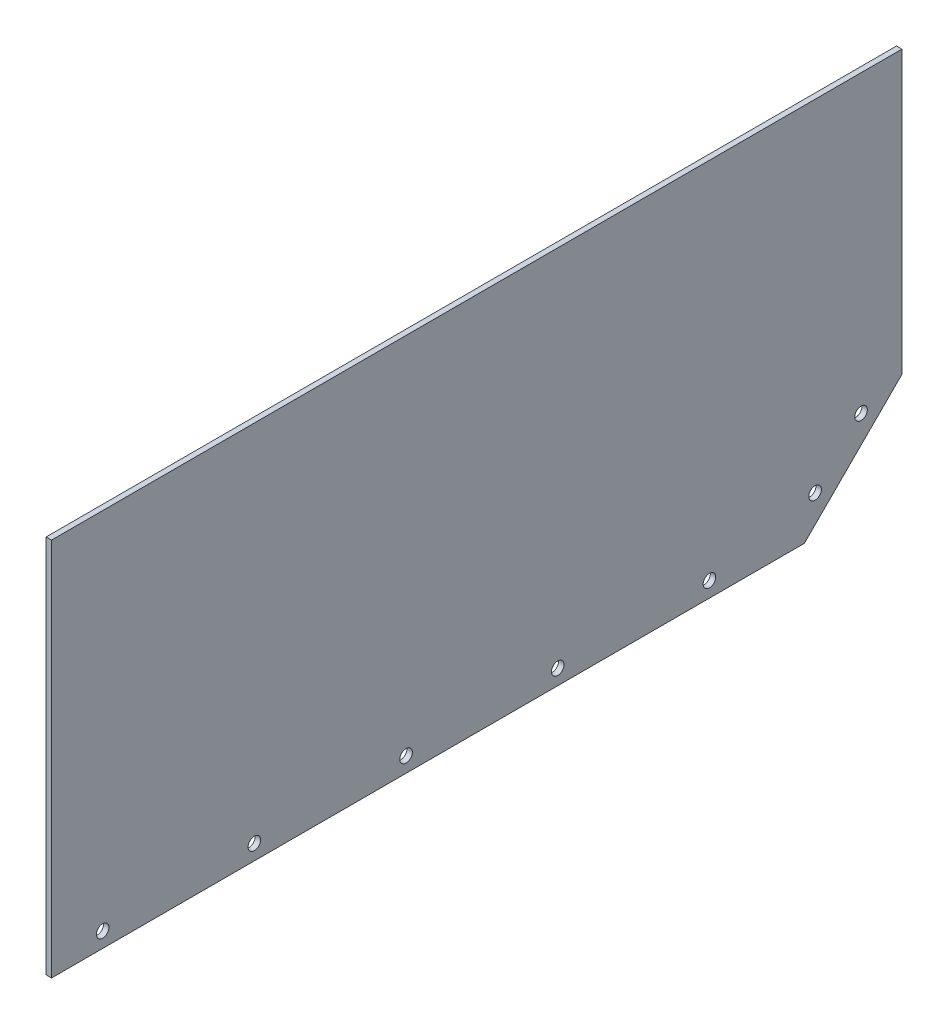
ISO-10303-21;
HEADER;
FILE_DESCRIPTION(('STEP AP214'),'2;1');
FILE_NAME('part.step','',(''),(''),'','','');
FILE_SCHEMA(('AUTOMOTIVE_DESIGN { 1 0 10303 214 1 1 1 1 }'));
ENDSEC;
DATA;
#1=APPLICATION_CONTEXT('core data for automotive mechanical design processes');
#2=APPLICATION_PROTOCOL_DEFINITION('international standard','automotive_design',2000,#1);
#3=PRODUCT_CONTEXT('',#1,'mechanical');
#4=PRODUCT('Part','Part','',(#3));
#5=PRODUCT_RELATED_PRODUCT_CATEGORY('part','',(#4));
#6=PRODUCT_DEFINITION_FORMATION('','',#4);
#7=PRODUCT_DEFINITION_CONTEXT('part definition',#1,'design');
#8=PRODUCT_DEFINITION('design','',#6,#7);
#9=PRODUCT_DEFINITION_SHAPE('','',#8);
#10=(LENGTH_UNIT() NAMED_UNIT(*) SI_UNIT(.MILLI.,.METRE.));
#11=(NAMED_UNIT(*) PLANE_ANGLE_UNIT() SI_UNIT($,.RADIAN.));
#12=(NAMED_UNIT(*) SI_UNIT($,.STERADIAN.) SOLID_ANGLE_UNIT());
#13=UNCERTAINTY_MEASURE_WITH_UNIT(LENGTH_MEASURE(1.E-05),#10,'distance_accuracy_value','');
#14=(GEOMETRIC_REPRESENTATION_CONTEXT(3) GLOBAL_UNCERTAINTY_ASSIGNED_CONTEXT((#13)) GLOBAL_UNIT_ASSIGNED_CONTEXT((#10,
#11,#12)) REPRESENTATION_CONTEXT('',''));
#15=CARTESIAN_POINT('',(0.,0.,0.));
#16=DIRECTION('',(0.,0.,1.));
#17=DIRECTION('',(1.,0.,0.));
#18=AXIS2_PLACEMENT_3D('',#15,#16,#17);
#19=CARTESIAN_POINT('',(1.5875,-130.81,-136.398));
#20=DIRECTION('',(-1.,0.,0.));
#21=DIRECTION('',(0.,0.,1.));
#22=AXIS2_PLACEMENT_3D('',#19,#20,#21);
#23=CYLINDRICAL_SURFACE('',#22,3.67500000000002);
#24=CARTESIAN_POINT('',(1.5875,-130.81,-136.398));
#25=DIRECTION('',(-1.,0.,0.));
#26=DIRECTION('',(0.,0.,1.));
#27=AXIS2_PLACEMENT_3D('',#24,#25,#26);
#28=CIRCLE('',#27,3.67500000000002);
#29=CARTESIAN_POINT('',(1.5875,-130.81,-132.723));
#30=VERTEX_POINT('',#29);
#31=EDGE_CURVE('E50',#30,#30,#28,.T.);
#32=ORIENTED_EDGE('',*,*,#31,.F.);
#33=EDGE_LOOP('',(#32));
#34=FACE_BOUND('',#33,.T.);
#35=CARTESIAN_POINT('',(-1.5875,-130.81,-136.398));
#36=DIRECTION('',(-1.,0.,0.));
#37=DIRECTION('',(0.,0.,1.));
#38=AXIS2_PLACEMENT_3D('',#35,#36,#37);
#39=CIRCLE('',#38,3.67500000000002);
#40=CARTESIAN_POINT('',(-1.5875,-130.81,-132.723));
#41=VERTEX_POINT('',#40);
#42=EDGE_CURVE('E11',#41,#41,#39,.T.);
#43=ORIENTED_EDGE('',*,*,#42,.T.);
#44=EDGE_LOOP('',(#43));
#45=FACE_BOUND('',#44,.T.);
#46=ADVANCED_FACE('F40',(#34,#45),#23,.F.);
#47=CARTESIAN_POINT('',(1.5875,-130.81,-47.498));
#48=DIRECTION('',(-1.,0.,0.));
#49=DIRECTION('',(0.,0.,1.));
#50=AXIS2_PLACEMENT_3D('',#47,#48,#49);
#51=CYLINDRICAL_SURFACE('',#50,3.67500000000002);
#52=CARTESIAN_POINT('',(1.5875,-130.81,-47.498));
#53=DIRECTION('',(-1.,0.,0.));
#54=DIRECTION('',(0.,0.,1.));
#55=AXIS2_PLACEMENT_3D('',#52,#53,#54);
#56=CIRCLE('',#55,3.67500000000002);
#57=CARTESIAN_POINT('',(1.5875,-130.81,-43.823));
#58=VERTEX_POINT('',#57);
#59=EDGE_CURVE('E157',#58,#58,#56,.T.);
#60=ORIENTED_EDGE('',*,*,#59,.F.);
#61=EDGE_LOOP('',(#60));
#62=FACE_BOUND('',#61,.T.);
#63=CARTESIAN_POINT('',(-1.5875,-130.81,-47.498));
#64=DIRECTION('',(-1.,0.,0.));
#65=DIRECTION('',(0.,0.,1.));
#66=AXIS2_PLACEMENT_3D('',#63,#64,#65);
#67=CIRCLE('',#66,3.67500000000002);
#68=CARTESIAN_POINT('',(-1.5875,-130.81,-43.823));
#69=VERTEX_POINT('',#68);
#70=EDGE_CURVE('E161',#69,#69,#67,.T.);
#71=ORIENTED_EDGE('',*,*,#70,.T.);
#72=EDGE_LOOP('',(#71));
#73=FACE_BOUND('',#72,.T.);
#74=ADVANCED_FACE('F219',(#62,#73),#51,.F.);
#75=CARTESIAN_POINT('',(1.5875,-130.81,41.402));
#76=DIRECTION('',(-1.,0.,0.));
#77=DIRECTION('',(0.,0.,1.));
#78=AXIS2_PLACEMENT_3D('',#75,#76,#77);
#79=CYLINDRICAL_SURFACE('',#78,3.67500000000002);
#80=CARTESIAN_POINT('',(1.5875,-130.81,41.402));
#81=DIRECTION('',(-1.,0.,0.));
#82=DIRECTION('',(0.,0.,1.));
#83=AXIS2_PLACEMENT_3D('',#80,#81,#82);
#84=CIRCLE('',#83,3.67500000000002);
#85=CARTESIAN_POINT('',(1.5875,-130.81,45.077));
#86=VERTEX_POINT('',#85);
#87=EDGE_CURVE('E149',#86,#86,#84,.T.);
#88=ORIENTED_EDGE('',*,*,#87,.F.);
#89=EDGE_LOOP('',(#88));
#90=FACE_BOUND('',#89,.T.);
#91=CARTESIAN_POINT('',(-1.5875,-130.81,41.402));
#92=DIRECTION('',(-1.,0.,0.));
#93=DIRECTION('',(0.,0.,1.));
#94=AXIS2_PLACEMENT_3D('',#91,#92,#93);
#95=CIRCLE('',#94,3.67500000000002);
#96=CARTESIAN_POINT('',(-1.5875,-130.81,45.077));
#97=VERTEX_POINT('',#96);
#98=EDGE_CURVE('E153',#97,#97,#95,.T.);
#99=ORIENTED_EDGE('',*,*,#98,.T.);
#100=EDGE_LOOP('',(#99));
#101=FACE_BOUND('',#100,.T.);
#102=ADVANCED_FACE('F216',(#90,#101),#79,.F.);
#103=CARTESIAN_POINT('',(1.5875,82.55,-249.174));
#104=DIRECTION('',(0.,0.,1.));
#105=DIRECTION('',(0.,-1.,0.));
#106=AXIS2_PLACEMENT_3D('',#103,#104,#105);
#107=PLANE('',#106);
#108=DIRECTION('',(0.,1.,0.));
#109=VECTOR('',#108,1.);
#110=CARTESIAN_POINT('',(-1.5875,82.55,-249.174));
#111=LINE('',#110,#109);
#112=CARTESIAN_POINT('',(-1.5875,-82.55,-249.174));
#113=VERTEX_POINT('',#112);
#114=CARTESIAN_POINT('',(-1.5875,82.55,-249.174));
#115=VERTEX_POINT('',#114);
#116=EDGE_CURVE('E126',#113,#115,#111,.T.);
#117=ORIENTED_EDGE('',*,*,#116,.T.);
#118=DIRECTION('',(-1.,0.,0.));
#119=VECTOR('',#118,1.);
#120=CARTESIAN_POINT('',(1.5875,82.55,-249.174));
#121=LINE('',#120,#119);
#122=CARTESIAN_POINT('',(1.5875,82.55,-249.174));
#123=VERTEX_POINT('',#122);
#124=EDGE_CURVE('E146',#123,#115,#121,.T.);
#125=ORIENTED_EDGE('',*,*,#124,.F.);
#126=DIRECTION('',(0.,1.,0.));
#127=VECTOR('',#126,1.);
#128=CARTESIAN_POINT('',(1.5875,82.55,-249.174));
#129=LINE('',#128,#127);
#130=CARTESIAN_POINT('',(1.5875,-82.55,-249.174));
#131=VERTEX_POINT('',#130);
#132=EDGE_CURVE('E59',#131,#123,#129,.T.);
#133=ORIENTED_EDGE('',*,*,#132,.F.);
#134=DIRECTION('',(-1.,0.,0.));
#135=VECTOR('',#134,1.);
#136=CARTESIAN_POINT('',(1.5875,-82.55,-249.174));
#137=LINE('',#136,#135);
#138=EDGE_CURVE('E77',#131,#113,#137,.T.);
#139=ORIENTED_EDGE('',*,*,#138,.T.);
#140=EDGE_LOOP('',(#117,#125,#133,#139));
#141=FACE_BOUND('',#140,.T.);
#142=ADVANCED_FACE('F209',(#141),#107,.F.);
#143=CARTESIAN_POINT('',(1.5875,82.55,249.174));
#144=DIRECTION('',(0.,-1.,0.));
#145=DIRECTION('',(0.,0.,-1.));
#146=AXIS2_PLACEMENT_3D('',#143,#144,#145);
#147=PLANE('',#146);
#148=DIRECTION('',(0.,0.,1.));
#149=VECTOR('',#148,1.);
#150=CARTESIAN_POINT('',(-1.5875,82.55,249.174));
#151=LINE('',#150,#149);
#152=CARTESIAN_POINT('',(-1.5875,82.55,249.174));
#153=VERTEX_POINT('',#152);
#154=EDGE_CURVE('E74',#115,#153,#151,.T.);
#155=ORIENTED_EDGE('',*,*,#154,.T.);
#156=DIRECTION('',(-1.,0.,0.));
#157=VECTOR('',#156,1.);
#158=CARTESIAN_POINT('',(1.5875,82.55,249.174));
#159=LINE('',#158,#157);
#160=CARTESIAN_POINT('',(1.5875,82.55,249.174));
#161=VERTEX_POINT('',#160);
#162=EDGE_CURVE('E101',#161,#153,#159,.T.);
#163=ORIENTED_EDGE('',*,*,#162,.F.);
#164=DIRECTION('',(0.,0.,1.));
#165=VECTOR('',#164,1.);
#166=CARTESIAN_POINT('',(1.5875,82.55,249.174));
#167=LINE('',#166,#165);
#168=EDGE_CURVE('E80',#123,#161,#167,.T.);
#169=ORIENTED_EDGE('',*,*,#168,.F.);
#170=ORIENTED_EDGE('',*,*,#124,.T.);
#171=EDGE_LOOP('',(#155,#163,#169,#170));
#172=FACE_BOUND('',#171,.T.);
#173=ADVANCED_FACE('F207',(#172),#147,.F.);
#174=CARTESIAN_POINT('',(1.5875,82.55,249.174));
#175=DIRECTION('',(0.,0.,-1.));
#176=DIRECTION('',(-1.,0.,0.));
#177=AXIS2_PLACEMENT_3D('',#174,#175,#176);
#178=PLANE('',#177);
#179=DIRECTION('',(0.,-1.,0.));
#180=VECTOR('',#179,1.);
#181=CARTESIAN_POINT('',(-1.5875,82.55,249.174));
#182=LINE('',#181,#180);
#183=CARTESIAN_POINT('',(-1.5875,-139.7,249.174));
#184=VERTEX_POINT('',#183);
#185=EDGE_CURVE('E95',#153,#184,#182,.T.);
#186=ORIENTED_EDGE('',*,*,#185,.T.);
#187=DIRECTION('',(1.,0.,0.));
#188=VECTOR('',#187,1.);
#189=CARTESIAN_POINT('',(-1.5875,-139.7,249.174));
#190=LINE('',#189,#188);
#191=CARTESIAN_POINT('',(1.5875,-139.7,249.174));
#192=VERTEX_POINT('',#191);
#193=EDGE_CURVE('E100',#184,#192,#190,.T.);
#194=ORIENTED_EDGE('',*,*,#193,.T.);
#195=DIRECTION('',(0.,-1.,0.));
#196=VECTOR('',#195,1.);
#197=CARTESIAN_POINT('',(1.5875,82.55,249.174));
#198=LINE('',#197,#196);
#199=EDGE_CURVE('E135',#161,#192,#198,.T.);
#200=ORIENTED_EDGE('',*,*,#199,.F.);
#201=ORIENTED_EDGE('',*,*,#162,.T.);
#202=EDGE_LOOP('',(#186,#194,#200,#201));
#203=FACE_BOUND('',#202,.T.);
#204=ADVANCED_FACE('F97',(#203),#178,.F.);
#205=CARTESIAN_POINT('',(1.5875,0.,0.));
#206=DIRECTION('',(1.,0.,0.));
#207=DIRECTION('',(0.,0.,-1.));
#208=AXIS2_PLACEMENT_3D('',#205,#206,#207);
#209=PLANE('',#208);
#210=CARTESIAN_POINT('',(1.5875,-90.30859133412,-225.250947647956));
#211=DIRECTION('',(-1.,0.,0.));
#212=DIRECTION('',(0.,0.,1.));
#213=AXIS2_PLACEMENT_3D('',#210,#211,#212);
#214=CIRCLE('',#213,3.67500000000002);
#215=CARTESIAN_POINT('',(1.5875,-90.30859133412,-221.575947647956));
#216=VERTEX_POINT('',#215);
#217=EDGE_CURVE('E185',#216,#216,#214,.T.);
#218=ORIENTED_EDGE('',*,*,#217,.T.);
#219=EDGE_LOOP('',(#218));
#220=FACE_BOUND('',#219,.T.);
#221=CARTESIAN_POINT('',(1.5875,-117.249359697327,-198.310179284748));
#222=DIRECTION('',(-1.,0.,0.));
#223=DIRECTION('',(0.,0.,1.));
#224=AXIS2_PLACEMENT_3D('',#221,#222,#223);
#225=CIRCLE('',#224,3.67500000000002);
#226=CARTESIAN_POINT('',(1.5875,-117.249359697327,-194.635179284748));
#227=VERTEX_POINT('',#226);
#228=EDGE_CURVE('E171',#227,#227,#225,.T.);
#229=ORIENTED_EDGE('',*,*,#228,.T.);
#230=EDGE_LOOP('',(#229));
#231=FACE_BOUND('',#230,.T.);
#232=CARTESIAN_POINT('',(1.5875,-130.81,130.302));
#233=DIRECTION('',(-1.,0.,0.));
#234=DIRECTION('',(0.,0.,1.));
#235=AXIS2_PLACEMENT_3D('',#232,#233,#234);
#236=CIRCLE('',#235,3.67500000000002);
#237=CARTESIAN_POINT('',(1.5875,-130.81,133.977));
#238=VERTEX_POINT('',#237);
#239=EDGE_CURVE('E170',#238,#238,#236,.T.);
#240=ORIENTED_EDGE('',*,*,#239,.T.);
#241=EDGE_LOOP('',(#240));
#242=FACE_BOUND('',#241,.T.);
#243=CARTESIAN_POINT('',(1.5875,-130.81,219.202));
#244=DIRECTION('',(-1.,0.,0.));
#245=DIRECTION('',(0.,0.,1.));
#246=AXIS2_PLACEMENT_3D('',#243,#244,#245);
#247=CIRCLE('',#246,3.67500000000002);
#248=CARTESIAN_POINT('',(1.5875,-130.81,222.877));
#249=VERTEX_POINT('',#248);
#250=EDGE_CURVE('E192',#249,#249,#247,.T.);
#251=ORIENTED_EDGE('',*,*,#250,.T.);
#252=EDGE_LOOP('',(#251));
#253=FACE_BOUND('',#252,.T.);
#254=ORIENTED_EDGE('',*,*,#132,.T.);
#255=ORIENTED_EDGE('',*,*,#168,.T.);
#256=ORIENTED_EDGE('',*,*,#199,.T.);
#257=DIRECTION('',(0.,0.,1.));
#258=VECTOR('',#257,1.);
#259=CARTESIAN_POINT('',(1.5875,-139.7,0.));
#260=LINE('',#259,#258);
#261=CARTESIAN_POINT('',(1.5875,-139.7,-192.024));
#262=VERTEX_POINT('',#261);
#263=EDGE_CURVE('E120',#262,#192,#260,.T.);
#264=ORIENTED_EDGE('',*,*,#263,.F.);
#265=DIRECTION('',(0.,-0.707106781186544,0.707106781186551));
#266=VECTOR('',#265,1.);
#267=CARTESIAN_POINT('',(1.5875,-165.862,-165.861999999999));
#268=LINE('',#267,#266);
#269=EDGE_CURVE('E115',#131,#262,#268,.T.);
#270=ORIENTED_EDGE('',*,*,#269,.F.);
#271=EDGE_LOOP('',(#254,#255,#256,#264,#270));
#272=FACE_BOUND('',#271,.T.);
#273=ORIENTED_EDGE('',*,*,#87,.T.);
#274=EDGE_LOOP('',(#273));
#275=FACE_BOUND('',#274,.T.);
#276=ORIENTED_EDGE('',*,*,#59,.T.);
#277=EDGE_LOOP('',(#276));
#278=FACE_BOUND('',#277,.T.);
#279=ORIENTED_EDGE('',*,*,#31,.T.);
#280=EDGE_LOOP('',(#279));
#281=FACE_BOUND('',#280,.T.);
#282=ADVANCED_FACE('F205',(#220,#231,#242,#253,#272,#275,#278,#281),#209,.T.);
#283=CARTESIAN_POINT('',(-1.5875,0.,0.));
#284=DIRECTION('',(1.,0.,0.));
#285=DIRECTION('',(0.,0.,-1.));
#286=AXIS2_PLACEMENT_3D('',#283,#284,#285);
#287=PLANE('',#286);
#288=CARTESIAN_POINT('',(-1.5875,-90.30859133412,-225.250947647956));
#289=DIRECTION('',(1.,0.,0.));
#290=DIRECTION('',(0.,0.,-1.));
#291=AXIS2_PLACEMENT_3D('',#288,#289,#290);
#292=CIRCLE('',#291,3.67500000000002);
#293=CARTESIAN_POINT('',(-1.5875,-90.30859133412,-228.925947647956));
#294=VERTEX_POINT('',#293);
#295=EDGE_CURVE('E43',#294,#294,#292,.T.);
#296=ORIENTED_EDGE('',*,*,#295,.T.);
#297=EDGE_LOOP('',(#296));
#298=FACE_BOUND('',#297,.T.);
#299=CARTESIAN_POINT('',(-1.5875,-117.249359697327,-198.310179284748));
#300=DIRECTION('',(1.,0.,0.));
#301=DIRECTION('',(0.,0.,-1.));
#302=AXIS2_PLACEMENT_3D('',#299,#300,#301);
#303=CIRCLE('',#302,3.67500000000002);
#304=CARTESIAN_POINT('',(-1.5875,-117.249359697327,-201.985179284748));
#305=VERTEX_POINT('',#304);
#306=EDGE_CURVE('E167',#305,#305,#303,.T.);
#307=ORIENTED_EDGE('',*,*,#306,.T.);
#308=EDGE_LOOP('',(#307));
#309=FACE_BOUND('',#308,.T.);
#310=CARTESIAN_POINT('',(-1.5875,-130.81,130.302));
#311=DIRECTION('',(-1.,0.,0.));
#312=DIRECTION('',(0.,0.,1.));
#313=AXIS2_PLACEMENT_3D('',#310,#311,#312);
#314=CIRCLE('',#313,3.67500000000002);
#315=CARTESIAN_POINT('',(-1.5875,-130.81,133.977));
#316=VERTEX_POINT('',#315);
#317=EDGE_CURVE('E177',#316,#316,#314,.T.);
#318=ORIENTED_EDGE('',*,*,#317,.F.);
#319=EDGE_LOOP('',(#318));
#320=FACE_BOUND('',#319,.T.);
#321=CARTESIAN_POINT('',(-1.5875,-130.81,219.202));
#322=DIRECTION('',(-1.,0.,0.));
#323=DIRECTION('',(0.,0.,1.));
#324=AXIS2_PLACEMENT_3D('',#321,#322,#323);
#325=CIRCLE('',#324,3.67500000000002);
#326=CARTESIAN_POINT('',(-1.5875,-130.81,222.877));
#327=VERTEX_POINT('',#326);
#328=EDGE_CURVE('E191',#327,#327,#325,.T.);
#329=ORIENTED_EDGE('',*,*,#328,.F.);
#330=EDGE_LOOP('',(#329));
#331=FACE_BOUND('',#330,.T.);
#332=ORIENTED_EDGE('',*,*,#116,.F.);
#333=DIRECTION('',(0.,-0.707106781186544,0.707106781186551));
#334=VECTOR('',#333,1.);
#335=CARTESIAN_POINT('',(-1.5875,-165.862,-165.861999999999));
#336=LINE('',#335,#334);
#337=CARTESIAN_POINT('',(-1.5875,-139.7,-192.024));
#338=VERTEX_POINT('',#337);
#339=EDGE_CURVE('E110',#113,#338,#336,.T.);
#340=ORIENTED_EDGE('',*,*,#339,.T.);
#341=DIRECTION('',(0.,0.,1.));
#342=VECTOR('',#341,1.);
#343=CARTESIAN_POINT('',(-1.5875,-139.7,0.));
#344=LINE('',#343,#342);
#345=EDGE_CURVE('E106',#338,#184,#344,.T.);
#346=ORIENTED_EDGE('',*,*,#345,.T.);
#347=ORIENTED_EDGE('',*,*,#185,.F.);
#348=ORIENTED_EDGE('',*,*,#154,.F.);
#349=EDGE_LOOP('',(#332,#340,#346,#347,#348));
#350=FACE_BOUND('',#349,.T.);
#351=ORIENTED_EDGE('',*,*,#98,.F.);
#352=EDGE_LOOP('',(#351));
#353=FACE_BOUND('',#352,.T.);
#354=ORIENTED_EDGE('',*,*,#70,.F.);
#355=EDGE_LOOP('',(#354));
#356=FACE_BOUND('',#355,.T.);
#357=ORIENTED_EDGE('',*,*,#42,.F.);
#358=EDGE_LOOP('',(#357));
#359=FACE_BOUND('',#358,.T.);
#360=ADVANCED_FACE('F107',(#298,#309,#320,#331,#350,#353,#356,#359),#287,.F.);
#361=CARTESIAN_POINT('',(-1.5875,-165.862,-165.861999999999));
#362=DIRECTION('',(0.,0.707106781186551,0.707106781186544));
#363=DIRECTION('',(0.,-0.707106781186544,0.707106781186551));
#364=AXIS2_PLACEMENT_3D('',#361,#362,#363);
#365=PLANE('',#364);
#366=ORIENTED_EDGE('',*,*,#269,.T.);
#367=DIRECTION('',(1.,0.,0.));
#368=VECTOR('',#367,1.);
#369=CARTESIAN_POINT('',(-1.5875,-139.7,-192.024));
#370=LINE('',#369,#368);
#371=EDGE_CURVE('E122',#338,#262,#370,.T.);
#372=ORIENTED_EDGE('',*,*,#371,.F.);
#373=ORIENTED_EDGE('',*,*,#339,.F.);
#374=ORIENTED_EDGE('',*,*,#138,.F.);
#375=EDGE_LOOP('',(#366,#372,#373,#374));
#376=FACE_BOUND('',#375,.T.);
#377=ADVANCED_FACE('F203',(#376),#365,.F.);
#378=CARTESIAN_POINT('',(-1.5875,-139.7,0.));
#379=DIRECTION('',(0.,1.,0.));
#380=DIRECTION('',(0.,0.,1.));
#381=AXIS2_PLACEMENT_3D('',#378,#379,#380);
#382=PLANE('',#381);
#383=ORIENTED_EDGE('',*,*,#263,.T.);
#384=ORIENTED_EDGE('',*,*,#193,.F.);
#385=ORIENTED_EDGE('',*,*,#345,.F.);
#386=ORIENTED_EDGE('',*,*,#371,.T.);
#387=EDGE_LOOP('',(#383,#384,#385,#386));
#388=FACE_BOUND('',#387,.T.);
#389=ADVANCED_FACE('F118',(#388),#382,.F.);
#390=CARTESIAN_POINT('',(1.5875,-130.81,219.202));
#391=DIRECTION('',(-1.,0.,0.));
#392=DIRECTION('',(0.,0.,1.));
#393=AXIS2_PLACEMENT_3D('',#390,#391,#392);
#394=CYLINDRICAL_SURFACE('',#393,3.67500000000002);
#395=ORIENTED_EDGE('',*,*,#250,.F.);
#396=EDGE_LOOP('',(#395));
#397=FACE_BOUND('',#396,.T.);
#398=ORIENTED_EDGE('',*,*,#328,.T.);
#399=EDGE_LOOP('',(#398));
#400=FACE_BOUND('',#399,.T.);
#401=ADVANCED_FACE('F242',(#397,#400),#394,.F.);
#402=CARTESIAN_POINT('',(1.5875,-130.81,130.302));
#403=DIRECTION('',(-1.,0.,0.));
#404=DIRECTION('',(0.,0.,1.));
#405=AXIS2_PLACEMENT_3D('',#402,#403,#404);
#406=CYLINDRICAL_SURFACE('',#405,3.67500000000002);
#407=ORIENTED_EDGE('',*,*,#239,.F.);
#408=EDGE_LOOP('',(#407));
#409=FACE_BOUND('',#408,.T.);
#410=ORIENTED_EDGE('',*,*,#317,.T.);
#411=EDGE_LOOP('',(#410));
#412=FACE_BOUND('',#411,.T.);
#413=ADVANCED_FACE('F246',(#409,#412),#406,.F.);
#414=CARTESIAN_POINT('',(1.5875,-117.249359697327,-198.310179284748));
#415=DIRECTION('',(-1.,0.,0.));
#416=DIRECTION('',(0.,0.,1.));
#417=AXIS2_PLACEMENT_3D('',#414,#415,#416);
#418=CYLINDRICAL_SURFACE('',#417,3.67500000000002);
#419=ORIENTED_EDGE('',*,*,#228,.F.);
#420=EDGE_LOOP('',(#419));
#421=FACE_BOUND('',#420,.T.);
#422=ORIENTED_EDGE('',*,*,#306,.F.);
#423=EDGE_LOOP('',(#422));
#424=FACE_BOUND('',#423,.T.);
#425=ADVANCED_FACE('F250',(#421,#424),#418,.F.);
#426=CARTESIAN_POINT('',(1.5875,-90.30859133412,-225.250947647956));
#427=DIRECTION('',(-1.,0.,0.));
#428=DIRECTION('',(0.,0.,1.));
#429=AXIS2_PLACEMENT_3D('',#426,#427,#428);
#430=CYLINDRICAL_SURFACE('',#429,3.67500000000002);
#431=ORIENTED_EDGE('',*,*,#217,.F.);
#432=EDGE_LOOP('',(#431));
#433=FACE_BOUND('',#432,.T.);
#434=ORIENTED_EDGE('',*,*,#295,.F.);
#435=EDGE_LOOP('',(#434));
#436=FACE_BOUND('',#435,.T.);
#437=ADVANCED_FACE('F254',(#433,#436),#430,.F.);
#438=CLOSED_SHELL('',(#46,#74,#102,#142,#173,#204,#282,#360,#377,#389,#401,#413,#425,#437));
#439=MANIFOLD_SOLID_BREP('B2',#438);
#440=ADVANCED_BREP_SHAPE_REPRESENTATION('',(#18,#439),#14);
#441=SHAPE_DEFINITION_REPRESENTATION(#9,#440);
ENDSEC;
END-ISO-10303-21;
